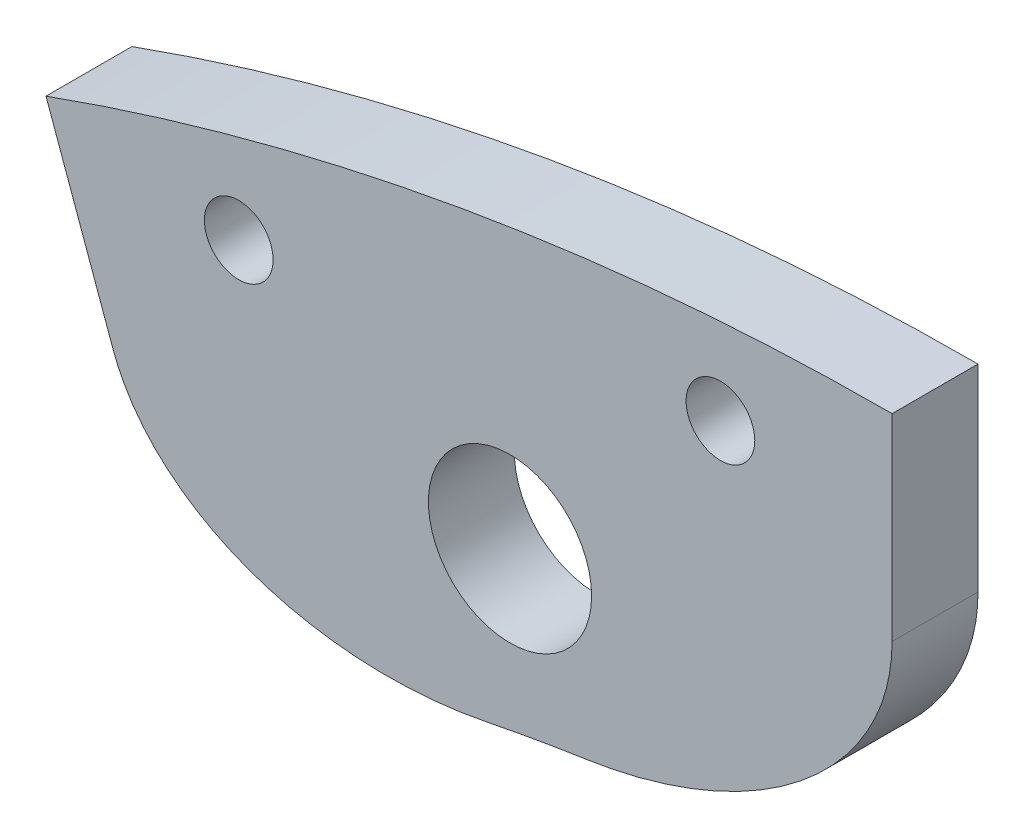
ISO-10303-21;
HEADER;
FILE_DESCRIPTION(('STEP AP214'),'2;1');
FILE_NAME('part.step','',(''),(''),'','','');
FILE_SCHEMA(('AUTOMOTIVE_DESIGN { 1 0 10303 214 1 1 1 1 }'));
ENDSEC;
DATA;
#1=APPLICATION_CONTEXT('core data for automotive mechanical design processes');
#2=APPLICATION_PROTOCOL_DEFINITION('international standard','automotive_design',2000,#1);
#3=PRODUCT_CONTEXT('',#1,'mechanical');
#4=PRODUCT('Part','Part','',(#3));
#5=PRODUCT_RELATED_PRODUCT_CATEGORY('part','',(#4));
#6=PRODUCT_DEFINITION_FORMATION('','',#4);
#7=PRODUCT_DEFINITION_CONTEXT('part definition',#1,'design');
#8=PRODUCT_DEFINITION('design','',#6,#7);
#9=PRODUCT_DEFINITION_SHAPE('','',#8);
#10=(LENGTH_UNIT() NAMED_UNIT(*) SI_UNIT(.MILLI.,.METRE.));
#11=(NAMED_UNIT(*) PLANE_ANGLE_UNIT() SI_UNIT($,.RADIAN.));
#12=(NAMED_UNIT(*) SI_UNIT($,.STERADIAN.) SOLID_ANGLE_UNIT());
#13=UNCERTAINTY_MEASURE_WITH_UNIT(LENGTH_MEASURE(1.E-05),#10,'distance_accuracy_value','');
#14=(GEOMETRIC_REPRESENTATION_CONTEXT(3) GLOBAL_UNCERTAINTY_ASSIGNED_CONTEXT((#13)) GLOBAL_UNIT_ASSIGNED_CONTEXT((#10,
#11,#12)) REPRESENTATION_CONTEXT('',''));
#15=CARTESIAN_POINT('',(0.,0.,0.));
#16=DIRECTION('',(0.,0.,1.));
#17=DIRECTION('',(1.,0.,0.));
#18=AXIS2_PLACEMENT_3D('',#15,#16,#17);
#19=CARTESIAN_POINT('',(0.,0.,5.));
#20=DIRECTION('',(0.,0.,-1.));
#21=DIRECTION('',(-1.,0.,0.));
#22=AXIS2_PLACEMENT_3D('',#19,#20,#21);
#23=CYLINDRICAL_SURFACE('',#22,145.);
#24=CARTESIAN_POINT('',(0.,0.,0.));
#25=DIRECTION('',(0.,0.,1.));
#26=DIRECTION('',(1.,0.,0.));
#27=AXIS2_PLACEMENT_3D('',#24,#25,#26);
#28=CIRCLE('',#27,145.);
#29=CARTESIAN_POINT('',(0.,145.,0.));
#30=VERTEX_POINT('',#29);
#31=CARTESIAN_POINT('',(-49.2512305416748,136.379310344828,0.));
#32=VERTEX_POINT('',#31);
#33=EDGE_CURVE('E127',#30,#32,#28,.T.);
#34=ORIENTED_EDGE('',*,*,#33,.T.);
#35=DIRECTION('',(0.,0.,-1.));
#36=VECTOR('',#35,1.);
#37=CARTESIAN_POINT('',(-49.2512305416748,136.379310344828,5.));
#38=LINE('',#37,#36);
#39=CARTESIAN_POINT('',(-49.2512305416748,136.379310344828,5.));
#40=VERTEX_POINT('',#39);
#41=EDGE_CURVE('E107',#40,#32,#38,.T.);
#42=ORIENTED_EDGE('',*,*,#41,.F.);
#43=CARTESIAN_POINT('',(0.,0.,5.));
#44=DIRECTION('',(0.,0.,1.));
#45=DIRECTION('',(1.,0.,0.));
#46=AXIS2_PLACEMENT_3D('',#43,#44,#45);
#47=CIRCLE('',#46,145.);
#48=CARTESIAN_POINT('',(0.,145.,5.));
#49=VERTEX_POINT('',#48);
#50=EDGE_CURVE('E115',#49,#40,#47,.T.);
#51=ORIENTED_EDGE('',*,*,#50,.F.);
#52=DIRECTION('',(0.,0.,-1.));
#53=VECTOR('',#52,1.);
#54=CARTESIAN_POINT('',(0.,145.,5.));
#55=LINE('',#54,#53);
#56=EDGE_CURVE('E129',#49,#30,#55,.T.);
#57=ORIENTED_EDGE('',*,*,#56,.T.);
#58=EDGE_LOOP('',(#34,#42,#51,#57));
#59=FACE_BOUND('',#58,.T.);
#60=ADVANCED_FACE('F42',(#59),#23,.T.);
#61=CARTESIAN_POINT('',(-49.2512305416748,136.379310344828,5.));
#62=DIRECTION('',(0.940546967895363,0.339663658908103,0.));
#63=DIRECTION('',(-0.339663658908103,0.940546967895363,0.));
#64=AXIS2_PLACEMENT_3D('',#61,#62,#63);
#65=PLANE('',#64);
#66=DIRECTION('',(0.339663658908103,-0.940546967895363,0.));
#67=VECTOR('',#66,1.);
#68=CARTESIAN_POINT('',(-49.2512305416748,136.379310344828,0.));
#69=LINE('',#68,#67);
#70=CARTESIAN_POINT('',(-45.3485967377616,125.572707121874,0.));
#71=VERTEX_POINT('',#70);
#72=EDGE_CURVE('E139',#32,#71,#69,.T.);
#73=ORIENTED_EDGE('',*,*,#72,.T.);
#74=CARTESIAN_POINT('',(-45.3485967377616,125.572707121874,5.25));
#75=CARTESIAN_POINT('',(-45.3485967377616,125.572707121874,3.41666666666666));
#76=CARTESIAN_POINT('',(-45.3485967377616,125.572707121874,1.58333333333334));
#77=CARTESIAN_POINT('',(-45.3485967377616,125.572707121874,-0.25));
#78=(BOUNDED_CURVE() B_SPLINE_CURVE(3,(#74,#75,#76,#77),.UNSPECIFIED.,.F.,
.F.) B_SPLINE_CURVE_WITH_KNOTS((4,4),(-0.00025,0.00525),
.UNSPECIFIED.) CURVE() GEOMETRIC_REPRESENTATION_ITEM() RATIONAL_B_SPLINE_CURVE((1.,1.,1.,1.)) REPRESENTATION_ITEM(''));
#79=CARTESIAN_POINT('',(-45.3485967377616,125.572707121874,5.));
#80=VERTEX_POINT('',#79);
#81=EDGE_CURVE('E110',#71,#80,#78,.F.);
#82=ORIENTED_EDGE('',*,*,#81,.T.);
#83=DIRECTION('',(0.339663658908103,-0.940546967895363,0.));
#84=VECTOR('',#83,1.);
#85=CARTESIAN_POINT('',(-49.2512305416748,136.379310344828,5.));
#86=LINE('',#85,#84);
#87=EDGE_CURVE('E102',#40,#80,#86,.T.);
#88=ORIENTED_EDGE('',*,*,#87,.F.);
#89=ORIENTED_EDGE('',*,*,#41,.T.);
#90=EDGE_LOOP('',(#73,#82,#88,#89));
#91=FACE_BOUND('',#90,.T.);
#92=ADVANCED_FACE('F105',(#91),#65,.F.);
#93=CARTESIAN_POINT('',(0.,0.,5.));
#94=DIRECTION('',(0.,0.,-1.));
#95=DIRECTION('',(-1.,0.,0.));
#96=AXIS2_PLACEMENT_3D('',#93,#94,#95);
#97=CYLINDRICAL_SURFACE('',#96,120.);
#98=CARTESIAN_POINT('',(0.,0.,0.));
#99=DIRECTION('',(0.,0.,-1.));
#100=DIRECTION('',(1.,0.,0.));
#101=AXIS2_PLACEMENT_3D('',#98,#99,#100);
#102=CIRCLE('',#101,120.);
#103=CARTESIAN_POINT('',(-23.5890287820927,117.658649155587,0.));
#104=VERTEX_POINT('',#103);
#105=CARTESIAN_POINT('',(-17.7777777777778,118.675821536166,0.));
#106=VERTEX_POINT('',#105);
#107=EDGE_CURVE('E136',#104,#106,#102,.T.);
#108=ORIENTED_EDGE('',*,*,#107,.T.);
#109=CARTESIAN_POINT('',(-17.7777777777778,118.675821536166,5.25));
#110=CARTESIAN_POINT('',(-17.7777777777778,118.675821536166,3.41666666666666));
#111=CARTESIAN_POINT('',(-17.7777777777778,118.675821536166,1.58333333333334));
#112=CARTESIAN_POINT('',(-17.7777777777778,118.675821536166,-0.25));
#113=(BOUNDED_CURVE() B_SPLINE_CURVE(3,(#109,#110,#111,#112),.UNSPECIFIED.,.F.,
.F.) B_SPLINE_CURVE_WITH_KNOTS((4,4),(-0.00025,0.00525),
.UNSPECIFIED.) CURVE() GEOMETRIC_REPRESENTATION_ITEM() RATIONAL_B_SPLINE_CURVE((1.,1.,1.,1.)) REPRESENTATION_ITEM(''));
#114=CARTESIAN_POINT('',(-17.7777777777778,118.675821536166,5.));
#115=VERTEX_POINT('',#114);
#116=EDGE_CURVE('E55',#106,#115,#113,.F.);
#117=ORIENTED_EDGE('',*,*,#116,.T.);
#118=CARTESIAN_POINT('',(0.,0.,5.));
#119=DIRECTION('',(0.,0.,-1.));
#120=DIRECTION('',(1.,0.,0.));
#121=AXIS2_PLACEMENT_3D('',#118,#119,#120);
#122=CIRCLE('',#121,120.);
#123=CARTESIAN_POINT('',(-23.5890287820927,117.658649155587,5.));
#124=VERTEX_POINT('',#123);
#125=EDGE_CURVE('E114',#124,#115,#122,.T.);
#126=ORIENTED_EDGE('',*,*,#125,.F.);
#127=CARTESIAN_POINT('',(-23.5890287820927,117.658649155587,-0.25));
#128=CARTESIAN_POINT('',(-23.5890287820927,117.658649155587,1.58333333333334));
#129=CARTESIAN_POINT('',(-23.5890287820927,117.658649155587,3.41666666666666));
#130=CARTESIAN_POINT('',(-23.5890287820927,117.658649155587,5.25));
#131=(BOUNDED_CURVE() B_SPLINE_CURVE(3,(#127,#128,#129,#130),.UNSPECIFIED.,.F.,
.F.) B_SPLINE_CURVE_WITH_KNOTS((4,4),(-0.00025,0.00525),
.UNSPECIFIED.) CURVE() GEOMETRIC_REPRESENTATION_ITEM() RATIONAL_B_SPLINE_CURVE((1.,1.,1.,1.)) REPRESENTATION_ITEM(''));
#132=EDGE_CURVE('E128',#124,#104,#131,.F.);
#133=ORIENTED_EDGE('',*,*,#132,.T.);
#134=EDGE_LOOP('',(#108,#117,#126,#133));
#135=FACE_BOUND('',#134,.T.);
#136=ADVANCED_FACE('F198',(#135),#97,.F.);
#137=CARTESIAN_POINT('',(0.,145.,5.));
#138=DIRECTION('',(-1.,0.,0.));
#139=DIRECTION('',(0.,0.,1.));
#140=AXIS2_PLACEMENT_3D('',#137,#138,#139);
#141=PLANE('',#140);
#142=DIRECTION('',(0.,1.,0.));
#143=VECTOR('',#142,1.);
#144=CARTESIAN_POINT('',(0.,145.,5.));
#145=LINE('',#144,#143);
#146=CARTESIAN_POINT('',(0.,133.510299228187,5.));
#147=VERTEX_POINT('',#146);
#148=EDGE_CURVE('E120',#147,#49,#145,.T.);
#149=ORIENTED_EDGE('',*,*,#148,.F.);
#150=CARTESIAN_POINT('',(0.,133.510299228187,-0.25));
#151=CARTESIAN_POINT('',(0.,133.510299228187,1.58333333333334));
#152=CARTESIAN_POINT('',(0.,133.510299228187,3.41666666666666));
#153=CARTESIAN_POINT('',(0.,133.510299228187,5.25));
#154=(BOUNDED_CURVE() B_SPLINE_CURVE(3,(#150,#151,#152,#153),.UNSPECIFIED.,.F.,
.F.) B_SPLINE_CURVE_WITH_KNOTS((4,4),(-0.00025,0.00525),
.UNSPECIFIED.) CURVE() GEOMETRIC_REPRESENTATION_ITEM() RATIONAL_B_SPLINE_CURVE((1.,1.,1.,1.)) REPRESENTATION_ITEM(''));
#155=CARTESIAN_POINT('',(0.,133.510299228187,0.));
#156=VERTEX_POINT('',#155);
#157=EDGE_CURVE('E276',#147,#156,#154,.F.);
#158=ORIENTED_EDGE('',*,*,#157,.T.);
#159=DIRECTION('',(0.,1.,0.));
#160=VECTOR('',#159,1.);
#161=CARTESIAN_POINT('',(0.,145.,0.));
#162=LINE('',#161,#160);
#163=EDGE_CURVE('E124',#156,#30,#162,.T.);
#164=ORIENTED_EDGE('',*,*,#163,.T.);
#165=ORIENTED_EDGE('',*,*,#56,.F.);
#166=EDGE_LOOP('',(#149,#158,#164,#165));
#167=FACE_BOUND('',#166,.T.);
#168=ADVANCED_FACE('F338',(#167),#141,.F.);
#169=CARTESIAN_POINT('',(0.,0.,5.));
#170=DIRECTION('',(0.,0.,1.));
#171=DIRECTION('',(1.,0.,0.));
#172=AXIS2_PLACEMENT_3D('',#169,#170,#171);
#173=PLANE('',#172);
#174=CARTESIAN_POINT('',(-22.2413793103448,127.068174797521,5.));
#175=DIRECTION('',(0.,0.,1.));
#176=DIRECTION('',(1.,0.,0.));
#177=AXIS2_PLACEMENT_3D('',#174,#175,#176);
#178=CIRCLE('',#177,4.75);
#179=CARTESIAN_POINT('',(-17.4913793103448,127.068174797521,5.));
#180=VERTEX_POINT('',#179);
#181=EDGE_CURVE('E171',#180,#180,#178,.T.);
#182=ORIENTED_EDGE('',*,*,#181,.F.);
#183=EDGE_LOOP('',(#182));
#184=FACE_BOUND('',#183,.T.);
#185=CARTESIAN_POINT('',(-38.0321344188171,134.735135549526,5.));
#186=DIRECTION('',(0.,0.,1.));
#187=DIRECTION('',(1.,0.,0.));
#188=AXIS2_PLACEMENT_3D('',#185,#186,#187);
#189=CIRCLE('',#188,2.00000000000003);
#190=CARTESIAN_POINT('',(-36.0321344188171,134.735135549526,5.));
#191=VERTEX_POINT('',#190);
#192=EDGE_CURVE('E163',#191,#191,#189,.T.);
#193=ORIENTED_EDGE('',*,*,#192,.F.);
#194=EDGE_LOOP('',(#193));
#195=FACE_BOUND('',#194,.T.);
#196=CARTESIAN_POINT('',(-9.99362041402374,139.642857142857,5.));
#197=DIRECTION('',(0.,0.,1.));
#198=DIRECTION('',(1.,0.,0.));
#199=AXIS2_PLACEMENT_3D('',#196,#197,#198);
#200=CIRCLE('',#199,2.);
#201=CARTESIAN_POINT('',(-7.99362041402374,139.642857142857,5.));
#202=VERTEX_POINT('',#201);
#203=EDGE_CURVE('E168',#202,#202,#200,.T.);
#204=ORIENTED_EDGE('',*,*,#203,.F.);
#205=EDGE_LOOP('',(#204));
#206=FACE_BOUND('',#205,.T.);
#207=ORIENTED_EDGE('',*,*,#125,.T.);
#208=CARTESIAN_POINT('',(0.,133.510299228187,5.));
#209=CARTESIAN_POINT('',(0.,121.338953576248,5.));
#210=CARTESIAN_POINT('',(-17.7777777777778,118.675821536166,5.));
#211=(BOUNDED_CURVE() B_SPLINE_CURVE(2,(#208,#209,#210),.UNSPECIFIED.,.F.,
.F.) B_SPLINE_CURVE_WITH_KNOTS((3,3),(0.,1.),
.UNSPECIFIED.) CURVE() GEOMETRIC_REPRESENTATION_ITEM() RATIONAL_B_SPLINE_CURVE((1.,
0.757676760943659,1.)) REPRESENTATION_ITEM(''));
#212=EDGE_CURVE('E12',#115,#147,#211,.F.);
#213=ORIENTED_EDGE('',*,*,#212,.T.);
#214=ORIENTED_EDGE('',*,*,#148,.T.);
#215=ORIENTED_EDGE('',*,*,#50,.T.);
#216=ORIENTED_EDGE('',*,*,#87,.T.);
#217=CARTESIAN_POINT('',(-23.5890287820927,117.658649155587,5.));
#218=CARTESIAN_POINT('',(-41.2144329397889,114.124984873737,5.));
#219=CARTESIAN_POINT('',(-45.3485967377616,125.572707121874,5.));
#220=(BOUNDED_CURVE() B_SPLINE_CURVE(2,(#217,#218,#219),.UNSPECIFIED.,.F.,
.F.) B_SPLINE_CURVE_WITH_KNOTS((3,3),(0.,1.),
.UNSPECIFIED.) CURVE() GEOMETRIC_REPRESENTATION_ITEM() RATIONAL_B_SPLINE_CURVE((1.,
0.757676760943659,1.)) REPRESENTATION_ITEM(''));
#221=EDGE_CURVE('E275',#80,#124,#220,.F.);
#222=ORIENTED_EDGE('',*,*,#221,.T.);
#223=EDGE_LOOP('',(#207,#213,#214,#215,#216,#222));
#224=FACE_BOUND('',#223,.T.);
#225=ADVANCED_FACE('F118',(#184,#195,#206,#224),#173,.T.);
#226=CARTESIAN_POINT('',(0.,0.,0.));
#227=DIRECTION('',(0.,0.,1.));
#228=DIRECTION('',(1.,0.,0.));
#229=AXIS2_PLACEMENT_3D('',#226,#227,#228);
#230=PLANE('',#229);
#231=CARTESIAN_POINT('',(-22.2413793103448,127.068174797521,0.));
#232=DIRECTION('',(0.,0.,1.));
#233=DIRECTION('',(1.,0.,0.));
#234=AXIS2_PLACEMENT_3D('',#231,#232,#233);
#235=CIRCLE('',#234,4.75);
#236=CARTESIAN_POINT('',(-17.4913793103448,127.068174797521,0.));
#237=VERTEX_POINT('',#236);
#238=EDGE_CURVE('E50',#237,#237,#235,.T.);
#239=ORIENTED_EDGE('',*,*,#238,.T.);
#240=EDGE_LOOP('',(#239));
#241=FACE_BOUND('',#240,.T.);
#242=CARTESIAN_POINT('',(-38.0321344188171,134.735135549526,0.));
#243=DIRECTION('',(0.,0.,1.));
#244=DIRECTION('',(1.,0.,0.));
#245=AXIS2_PLACEMENT_3D('',#242,#243,#244);
#246=CIRCLE('',#245,2.00000000000003);
#247=CARTESIAN_POINT('',(-36.0321344188171,134.735135549526,0.));
#248=VERTEX_POINT('',#247);
#249=EDGE_CURVE('E160',#248,#248,#246,.T.);
#250=ORIENTED_EDGE('',*,*,#249,.T.);
#251=EDGE_LOOP('',(#250));
#252=FACE_BOUND('',#251,.T.);
#253=CARTESIAN_POINT('',(-9.99362041402374,139.642857142857,0.));
#254=DIRECTION('',(0.,0.,1.));
#255=DIRECTION('',(1.,0.,0.));
#256=AXIS2_PLACEMENT_3D('',#253,#254,#255);
#257=CIRCLE('',#256,2.);
#258=CARTESIAN_POINT('',(-7.99362041402374,139.642857142857,0.));
#259=VERTEX_POINT('',#258);
#260=EDGE_CURVE('E175',#259,#259,#257,.T.);
#261=ORIENTED_EDGE('',*,*,#260,.T.);
#262=EDGE_LOOP('',(#261));
#263=FACE_BOUND('',#262,.T.);
#264=ORIENTED_EDGE('',*,*,#163,.F.);
#265=CARTESIAN_POINT('',(-17.7777777777778,118.675821536166,0.));
#266=CARTESIAN_POINT('',(0.,121.338953576248,0.));
#267=CARTESIAN_POINT('',(0.,133.510299228187,0.));
#268=(BOUNDED_CURVE() B_SPLINE_CURVE(2,(#265,#266,#267),.UNSPECIFIED.,.F.,
.F.) B_SPLINE_CURVE_WITH_KNOTS((3,3),(0.,1.),
.UNSPECIFIED.) CURVE() GEOMETRIC_REPRESENTATION_ITEM() RATIONAL_B_SPLINE_CURVE((1.,
0.757676760943659,1.)) REPRESENTATION_ITEM(''));
#269=EDGE_CURVE('E70',#156,#106,#268,.F.);
#270=ORIENTED_EDGE('',*,*,#269,.T.);
#271=ORIENTED_EDGE('',*,*,#107,.F.);
#272=CARTESIAN_POINT('',(-45.3485967377616,125.572707121874,0.));
#273=CARTESIAN_POINT('',(-41.2144329397889,114.124984873737,0.));
#274=CARTESIAN_POINT('',(-23.5890287820927,117.658649155587,0.));
#275=(BOUNDED_CURVE() B_SPLINE_CURVE(2,(#272,#273,#274),.UNSPECIFIED.,.F.,
.F.) B_SPLINE_CURVE_WITH_KNOTS((3,3),(0.,1.),
.UNSPECIFIED.) CURVE() GEOMETRIC_REPRESENTATION_ITEM() RATIONAL_B_SPLINE_CURVE((1.,
0.757676760943659,1.)) REPRESENTATION_ITEM(''));
#276=EDGE_CURVE('E132',#104,#71,#275,.F.);
#277=ORIENTED_EDGE('',*,*,#276,.T.);
#278=ORIENTED_EDGE('',*,*,#72,.F.);
#279=ORIENTED_EDGE('',*,*,#33,.F.);
#280=EDGE_LOOP('',(#264,#270,#271,#277,#278,#279));
#281=FACE_BOUND('',#280,.T.);
#282=ADVANCED_FACE('F277',(#241,#252,#263,#281),#230,.F.);
#283=CARTESIAN_POINT('',(-9.99362041402374,139.642857142857,0.));
#284=DIRECTION('',(0.,0.,1.));
#285=DIRECTION('',(1.,0.,0.));
#286=AXIS2_PLACEMENT_3D('',#283,#284,#285);
#287=CYLINDRICAL_SURFACE('',#286,2.);
#288=ORIENTED_EDGE('',*,*,#260,.F.);
#289=EDGE_LOOP('',(#288));
#290=FACE_BOUND('',#289,.T.);
#291=ORIENTED_EDGE('',*,*,#203,.T.);
#292=EDGE_LOOP('',(#291));
#293=FACE_BOUND('',#292,.T.);
#294=ADVANCED_FACE('F340',(#290,#293),#287,.F.);
#295=CARTESIAN_POINT('',(-38.0321344188171,134.735135549526,0.));
#296=DIRECTION('',(0.,0.,1.));
#297=DIRECTION('',(1.,0.,0.));
#298=AXIS2_PLACEMENT_3D('',#295,#296,#297);
#299=CYLINDRICAL_SURFACE('',#298,2.00000000000003);
#300=ORIENTED_EDGE('',*,*,#249,.F.);
#301=EDGE_LOOP('',(#300));
#302=FACE_BOUND('',#301,.T.);
#303=ORIENTED_EDGE('',*,*,#192,.T.);
#304=EDGE_LOOP('',(#303));
#305=FACE_BOUND('',#304,.T.);
#306=ADVANCED_FACE('F210',(#302,#305),#299,.F.);
#307=CARTESIAN_POINT('',(-23.5890287820927,117.658649155587,5.25));
#308=CARTESIAN_POINT('',(-23.5890287820927,117.658649155587,3.41666666666666));
#309=CARTESIAN_POINT('',(-23.5890287820927,117.658649155587,1.58333333333334));
#310=CARTESIAN_POINT('',(-23.5890287820927,117.658649155587,-0.25));
#311=CARTESIAN_POINT('',(-41.2144329397889,114.124984873737,5.25));
#312=CARTESIAN_POINT('',(-41.2144329397889,114.124984873737,3.41666666666666));
#313=CARTESIAN_POINT('',(-41.2144329397889,114.124984873737,1.58333333333334));
#314=CARTESIAN_POINT('',(-41.2144329397889,114.124984873737,-0.25));
#315=CARTESIAN_POINT('',(-45.3485967377616,125.572707121874,5.25));
#316=CARTESIAN_POINT('',(-45.3485967377616,125.572707121874,3.41666666666666));
#317=CARTESIAN_POINT('',(-45.3485967377616,125.572707121874,1.58333333333334));
#318=CARTESIAN_POINT('',(-45.3485967377616,125.572707121874,-0.25));
#319=(BOUNDED_SURFACE() B_SPLINE_SURFACE(2,3,((#307,#308,#309,#310),(#311,#312,#313,#314),(#315,
#316,#317,#318)),.UNSPECIFIED.,.F.,.F.,.F.) B_SPLINE_SURFACE_WITH_KNOTS((3,3),(4,4),(0.,1.),
(-0.00025,0.00525),
.UNSPECIFIED.) GEOMETRIC_REPRESENTATION_ITEM() RATIONAL_B_SPLINE_SURFACE(((1.,1.,1.,1.),
(0.757676760943659,0.757676760943659,0.757676760943659,0.757676760943659),(1.,1.,1.,1.))) REPRESENTATION_ITEM('') SURFACE());
#320=ORIENTED_EDGE('',*,*,#221,.F.);
#321=ORIENTED_EDGE('',*,*,#81,.F.);
#322=ORIENTED_EDGE('',*,*,#276,.F.);
#323=ORIENTED_EDGE('',*,*,#132,.F.);
#324=EDGE_LOOP('',(#320,#321,#322,#323));
#325=FACE_BOUND('',#324,.T.);
#326=ADVANCED_FACE('F203',(#325),#319,.T.);
#327=CARTESIAN_POINT('',(0.,133.510299228187,5.25));
#328=CARTESIAN_POINT('',(0.,133.510299228187,3.41666666666666));
#329=CARTESIAN_POINT('',(0.,133.510299228187,1.58333333333334));
#330=CARTESIAN_POINT('',(0.,133.510299228187,-0.25));
#331=CARTESIAN_POINT('',(0.,121.338953576248,5.25));
#332=CARTESIAN_POINT('',(0.,121.338953576248,3.41666666666666));
#333=CARTESIAN_POINT('',(0.,121.338953576248,1.58333333333334));
#334=CARTESIAN_POINT('',(0.,121.338953576248,-0.25));
#335=CARTESIAN_POINT('',(-17.7777777777778,118.675821536166,5.25));
#336=CARTESIAN_POINT('',(-17.7777777777778,118.675821536166,3.41666666666666));
#337=CARTESIAN_POINT('',(-17.7777777777778,118.675821536166,1.58333333333334));
#338=CARTESIAN_POINT('',(-17.7777777777778,118.675821536166,-0.25));
#339=(BOUNDED_SURFACE() B_SPLINE_SURFACE(2,3,((#327,#328,#329,#330),(#331,#332,#333,#334),(#335,
#336,#337,#338)),.UNSPECIFIED.,.F.,.F.,.F.) B_SPLINE_SURFACE_WITH_KNOTS((3,3),(4,4),(0.,1.),
(-0.00025,0.00525),
.UNSPECIFIED.) GEOMETRIC_REPRESENTATION_ITEM() RATIONAL_B_SPLINE_SURFACE(((1.,1.,1.,1.),
(0.757676760943659,0.757676760943659,0.757676760943659,0.757676760943659),(1.,1.,1.,1.))) REPRESENTATION_ITEM('') SURFACE());
#340=ORIENTED_EDGE('',*,*,#212,.F.);
#341=ORIENTED_EDGE('',*,*,#116,.F.);
#342=ORIENTED_EDGE('',*,*,#269,.F.);
#343=ORIENTED_EDGE('',*,*,#157,.F.);
#344=EDGE_LOOP('',(#340,#341,#342,#343));
#345=FACE_BOUND('',#344,.T.);
#346=ADVANCED_FACE('F45',(#345),#339,.T.);
#347=CARTESIAN_POINT('',(-22.2413793103448,127.068174797521,-5.));
#348=DIRECTION('',(0.,0.,1.));
#349=DIRECTION('',(1.,0.,0.));
#350=AXIS2_PLACEMENT_3D('',#347,#348,#349);
#351=CYLINDRICAL_SURFACE('',#350,4.75);
#352=ORIENTED_EDGE('',*,*,#181,.T.);
#353=EDGE_LOOP('',(#352));
#354=FACE_BOUND('',#353,.T.);
#355=ORIENTED_EDGE('',*,*,#238,.F.);
#356=EDGE_LOOP('',(#355));
#357=FACE_BOUND('',#356,.T.);
#358=ADVANCED_FACE('F424',(#354,#357),#351,.F.);
#359=CLOSED_SHELL('',(#60,#92,#136,#168,#225,#282,#294,#306,#326,#346,#358));
#360=MANIFOLD_SOLID_BREP('B2',#359);
#361=ADVANCED_BREP_SHAPE_REPRESENTATION('',(#18,#360),#14);
#362=SHAPE_DEFINITION_REPRESENTATION(#9,#361);
ENDSEC;
END-ISO-10303-21;
